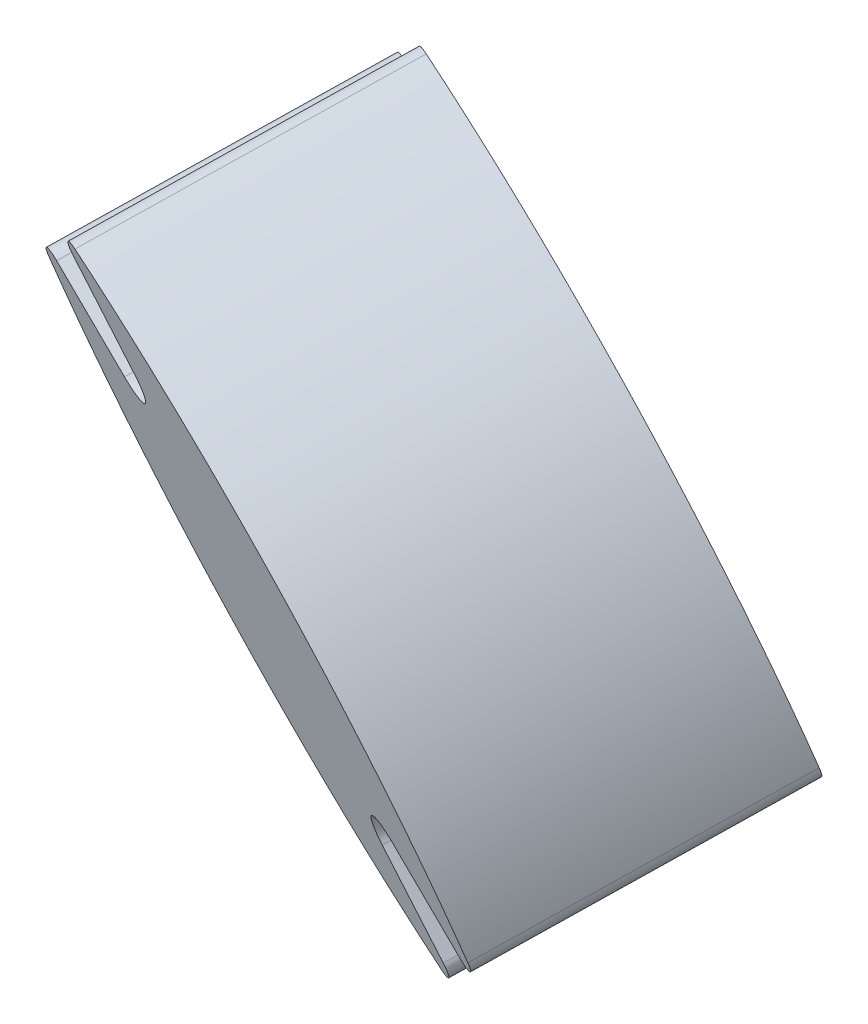
ISO-10303-21;
HEADER;
FILE_DESCRIPTION(('STEP AP214'),'2;1');
FILE_NAME('part.step','',(''),(''),'','','');
FILE_SCHEMA(('AUTOMOTIVE_DESIGN { 1 0 10303 214 1 1 1 1 }'));
ENDSEC;
DATA;
#1=APPLICATION_CONTEXT('core data for automotive mechanical design processes');
#2=APPLICATION_PROTOCOL_DEFINITION('international standard','automotive_design',2000,#1);
#3=PRODUCT_CONTEXT('',#1,'mechanical');
#4=PRODUCT('Part','Part','',(#3));
#5=PRODUCT_RELATED_PRODUCT_CATEGORY('part','',(#4));
#6=PRODUCT_DEFINITION_FORMATION('','',#4);
#7=PRODUCT_DEFINITION_CONTEXT('part definition',#1,'design');
#8=PRODUCT_DEFINITION('design','',#6,#7);
#9=PRODUCT_DEFINITION_SHAPE('','',#8);
#10=(LENGTH_UNIT() NAMED_UNIT(*) SI_UNIT(.MILLI.,.METRE.));
#11=(NAMED_UNIT(*) PLANE_ANGLE_UNIT() SI_UNIT($,.RADIAN.));
#12=(NAMED_UNIT(*) SI_UNIT($,.STERADIAN.) SOLID_ANGLE_UNIT());
#13=UNCERTAINTY_MEASURE_WITH_UNIT(LENGTH_MEASURE(1.E-05),#10,'distance_accuracy_value','');
#14=(GEOMETRIC_REPRESENTATION_CONTEXT(3) GLOBAL_UNCERTAINTY_ASSIGNED_CONTEXT((#13)) GLOBAL_UNIT_ASSIGNED_CONTEXT((#10,
#11,#12)) REPRESENTATION_CONTEXT('',''));
#15=CARTESIAN_POINT('',(0.,0.,0.));
#16=DIRECTION('',(0.,0.,1.));
#17=DIRECTION('',(1.,0.,0.));
#18=AXIS2_PLACEMENT_3D('',#15,#16,#17);
#19=CARTESIAN_POINT('',(24.2522786898409,17.837579396562,-3.28254901722241));
#20=DIRECTION('',(0.7696030963663,0.44294277050906,0.459905181659395));
#21=DIRECTION('',(0.512972214604096,0.,-0.858405211449796));
#22=AXIS2_PLACEMENT_3D('',#19,#20,#21);
#23=PLANE('',#22);
#24=DIRECTION('',(0.538333378028067,-0.837440387104316,-0.0942908911160778));
#25=VECTOR('',#24,1.);
#26=CARTESIAN_POINT('',(24.2522786898409,17.837579396562,-3.28254901722241));
#27=LINE('',#26,#25);
#28=CARTESIAN_POINT('',(24.2522786898409,17.8375793965621,-3.28254901722241));
#29=VERTEX_POINT('',#28);
#30=CARTESIAN_POINT('',(24.7126216075303,17.1214622711432,-3.36317961844372));
#31=VERTEX_POINT('',#30);
#32=EDGE_CURVE('E136',#29,#31,#27,.T.);
#33=ORIENTED_EDGE('',*,*,#32,.T.);
#34=DIRECTION('',(0.343377704815397,0.320148871777388,-0.882947592858928));
#35=VECTOR('',#34,1.);
#36=CARTESIAN_POINT('',(24.7126216075302,17.1214622711432,-3.36317961844372));
#37=LINE('',#36,#35);
#38=CARTESIAN_POINT('',(25.5848009777614,17.9346404054578,-5.6058665043054));
#39=VERTEX_POINT('',#38);
#40=EDGE_CURVE('E126',#39,#31,#37,.F.);
#41=ORIENTED_EDGE('',*,*,#40,.F.);
#42=DIRECTION('',(-0.538333378028076,0.837440387104308,0.0942908911160961));
#43=VECTOR('',#42,1.);
#44=CARTESIAN_POINT('',(25.5848009777614,17.9346404054578,-5.6058665043054));
#45=LINE('',#44,#43);
#46=CARTESIAN_POINT('',(25.124458060072,18.6507575308766,-5.5252359030841));
#47=VERTEX_POINT('',#46);
#48=EDGE_CURVE('E198',#39,#47,#45,.T.);
#49=ORIENTED_EDGE('',*,*,#48,.T.);
#50=DIRECTION('',(0.343377704815397,0.320148871777388,-0.882947592858928));
#51=VECTOR('',#50,1.);
#52=CARTESIAN_POINT('',(24.2522786898409,17.837579396562,-3.28254901722242));
#53=LINE('',#52,#51);
#54=EDGE_CURVE('E129',#47,#29,#53,.F.);
#55=ORIENTED_EDGE('',*,*,#54,.T.);
#56=EDGE_LOOP('',(#33,#41,#49,#55));
#57=FACE_BOUND('',#56,.T.);
#58=ADVANCED_FACE('F17',(#57),#23,.T.);
#59=CARTESIAN_POINT('',(21.9689361588296,20.293136827309,-3.28017625642764));
#60=DIRECTION('',(0.498079777136854,0.734944997551023,0.460187338137447));
#61=DIRECTION('',(-0.827806849443742,0.561013208413158,0.));
#62=AXIS2_PLACEMENT_3D('',#59,#60,#61);
#63=PLANE('',#62);
#64=DIRECTION('',(0.796246373582333,-0.597796412229437,0.0929040477191262));
#65=VECTOR('',#64,1.);
#66=CARTESIAN_POINT('',(21.2880451092031,20.8043281370472,-3.35962093167485));
#67=LINE('',#66,#65);
#68=CARTESIAN_POINT('',(21.2880451092032,20.8043281370472,-3.35962093167486));
#69=VERTEX_POINT('',#68);
#70=CARTESIAN_POINT('',(21.9689361588295,20.2931368273091,-3.28017625642764));
#71=VERTEX_POINT('',#70);
#72=EDGE_CURVE('E125',#69,#71,#67,.T.);
#73=ORIENTED_EDGE('',*,*,#72,.T.);
#74=DIRECTION('',(0.343377704815388,0.320148871777399,-0.882947592858928));
#75=VECTOR('',#74,1.);
#76=CARTESIAN_POINT('',(21.9689361588296,20.293136827309,-3.28017625642764));
#77=LINE('',#76,#75);
#78=CARTESIAN_POINT('',(22.8411155290606,21.1063149616236,-5.52286314228933));
#79=VERTEX_POINT('',#78);
#80=EDGE_CURVE('E109',#71,#79,#77,.T.);
#81=ORIENTED_EDGE('',*,*,#80,.T.);
#82=DIRECTION('',(-0.79624637358233,0.59779641222944,-0.0929040477191298));
#83=VECTOR('',#82,1.);
#84=CARTESIAN_POINT('',(22.8411155290606,21.1063149616236,-5.52286314228933));
#85=LINE('',#84,#83);
#86=CARTESIAN_POINT('',(22.1602244794343,21.6175062713618,-5.60230781753654));
#87=VERTEX_POINT('',#86);
#88=EDGE_CURVE('E118',#79,#87,#85,.T.);
#89=ORIENTED_EDGE('',*,*,#88,.T.);
#90=DIRECTION('',(0.343377704815397,0.320148871777388,-0.882947592858928));
#91=VECTOR('',#90,1.);
#92=CARTESIAN_POINT('',(21.2880451092032,20.8043281370472,-3.35962093167484));
#93=LINE('',#92,#91);
#94=EDGE_CURVE('E166',#69,#87,#93,.T.);
#95=ORIENTED_EDGE('',*,*,#94,.F.);
#96=EDGE_LOOP('',(#73,#81,#89,#95));
#97=FACE_BOUND('',#96,.T.);
#98=ADVANCED_FACE('F128',(#97),#63,.T.);
#99=CARTESIAN_POINT('',(24.447757876318,17.9500868602714,-3.16573310108092));
#100=DIRECTION('',(0.343377704815397,0.320148871777388,-0.882947592858928));
#101=DIRECTION('',(-0.932001392324764,0.,-0.36245469331311));
#102=AXIS2_PLACEMENT_3D('',#99,#100,#101);
#103=CYLINDRICAL_SURFACE('',#102,0.254);
#104=DIRECTION('',(0.343377704815401,0.320148871777389,-0.882947592858926));
#105=VECTOR('',#104,1.);
#106=CARTESIAN_POINT('',(24.5742701397107,18.1367628896494,-3.04884551719401));
#107=LINE('',#106,#105);
#108=CARTESIAN_POINT('',(24.5742701397107,18.1367628896494,-3.04884551719401));
#109=VERTEX_POINT('',#108);
#110=CARTESIAN_POINT('',(25.4464495099418,18.9499410239639,-5.29153240305569));
#111=VERTEX_POINT('',#110);
#112=EDGE_CURVE('E185',#109,#111,#107,.T.);
#113=ORIENTED_EDGE('',*,*,#112,.F.);
#114=CARTESIAN_POINT('',(24.447757876318,17.9500868602714,-3.16573310108092));
#115=DIRECTION('',(0.343377704815397,0.320148871777388,-0.882947592858928));
#116=DIRECTION('',(-0.932001392324764,0.,-0.36245469331311));
#117=AXIS2_PLACEMENT_3D('',#114,#115,#116);
#118=CIRCLE('',#117,0.254);
#119=EDGE_CURVE('E20',#29,#109,#118,.T.);
#120=ORIENTED_EDGE('',*,*,#119,.F.);
#121=ORIENTED_EDGE('',*,*,#54,.F.);
#122=CARTESIAN_POINT('',(25.3199372465491,18.763264994586,-5.40841998694261));
#123=DIRECTION('',(0.343377704815397,0.320148871777388,-0.882947592858928));
#124=DIRECTION('',(-0.932001392324764,0.,-0.36245469331311));
#125=AXIS2_PLACEMENT_3D('',#122,#123,#124);
#126=CIRCLE('',#125,0.254);
#127=EDGE_CURVE('E115',#111,#47,#126,.F.);
#128=ORIENTED_EDGE('',*,*,#127,.F.);
#129=EDGE_LOOP('',(#113,#120,#121,#128));
#130=FACE_BOUND('',#129,.T.);
#131=ADVANCED_FACE('F186',(#130),#103,.F.);
#132=CARTESIAN_POINT('',(22.0954484222223,20.4798128566871,-3.16328867254073));
#133=DIRECTION('',(0.343377704815397,0.320148871777388,-0.882947592858928));
#134=DIRECTION('',(-0.932001392324764,0.,-0.36245469331311));
#135=AXIS2_PLACEMENT_3D('',#132,#133,#134);
#136=CYLINDRICAL_SURFACE('',#135,0.254);
#137=CARTESIAN_POINT('',(22.0954484222223,20.479812856687,-3.1632886725407));
#138=DIRECTION('',(0.343377704815397,0.320148871777388,-0.882947592858928));
#139=DIRECTION('',(-0.932001392324764,0.,-0.36245469331311));
#140=AXIS2_PLACEMENT_3D('',#137,#138,#139);
#141=CIRCLE('',#140,0.254);
#142=CARTESIAN_POINT('',(22.2909276086993,20.5923203203963,-3.04647275639924));
#143=VERTEX_POINT('',#142);
#144=EDGE_CURVE('E100',#143,#71,#141,.T.);
#145=ORIENTED_EDGE('',*,*,#144,.F.);
#146=DIRECTION('',(-0.343377704815397,-0.320148871777391,0.882947592858927));
#147=VECTOR('',#146,1.);
#148=CARTESIAN_POINT('',(23.1631069789304,21.4054984547109,-5.28915964226094));
#149=LINE('',#148,#147);
#150=CARTESIAN_POINT('',(23.1631069789304,21.4054984547109,-5.28915964226094));
#151=VERTEX_POINT('',#150);
#152=EDGE_CURVE('E112',#151,#143,#149,.T.);
#153=ORIENTED_EDGE('',*,*,#152,.F.);
#154=CARTESIAN_POINT('',(22.9676277924534,21.2929909910016,-5.40597555840241));
#155=DIRECTION('',(0.343377704815397,0.320148871777388,-0.882947592858928));
#156=DIRECTION('',(-0.932001392324764,0.,-0.36245469331311));
#157=AXIS2_PLACEMENT_3D('',#154,#155,#156);
#158=CIRCLE('',#157,0.254);
#159=EDGE_CURVE('E105',#79,#151,#158,.F.);
#160=ORIENTED_EDGE('',*,*,#159,.F.);
#161=ORIENTED_EDGE('',*,*,#80,.F.);
#162=EDGE_LOOP('',(#145,#153,#160,#161));
#163=FACE_BOUND('',#162,.T.);
#164=ADVANCED_FACE('F107',(#163),#136,.F.);
#165=CARTESIAN_POINT('',(24.6148820142917,17.0652085392885,-3.42158757651447));
#166=DIRECTION('',(0.343377704815397,0.320148871777388,-0.882947592858928));
#167=DIRECTION('',(-0.932001392324764,0.,-0.36245469331311));
#168=AXIS2_PLACEMENT_3D('',#165,#166,#167);
#169=CYLINDRICAL_SURFACE('',#168,0.127);
#170=DIRECTION('',(0.343377704815394,0.320148871777391,-0.882947592858928));
#171=VECTOR('',#170,1.);
#172=CARTESIAN_POINT('',(24.5899172271825,16.9515703869446,-3.47250053887614));
#173=LINE('',#172,#171);
#174=CARTESIAN_POINT('',(25.4620965974136,17.7647485212592,-5.71518742473783));
#175=VERTEX_POINT('',#174);
#176=CARTESIAN_POINT('',(24.5899172271825,16.9515703869446,-3.47250053887614));
#177=VERTEX_POINT('',#176);
#178=EDGE_CURVE('E205',#175,#177,#173,.F.);
#179=ORIENTED_EDGE('',*,*,#178,.F.);
#180=CARTESIAN_POINT('',(25.4870613845229,17.8783866736031,-5.66427446237615));
#181=DIRECTION('',(0.343377704815397,0.320148871777388,-0.882947592858928));
#182=DIRECTION('',(-0.932001392324764,0.,-0.36245469331311));
#183=AXIS2_PLACEMENT_3D('',#180,#181,#182);
#184=CIRCLE('',#183,0.127);
#185=EDGE_CURVE('E168',#175,#39,#184,.F.);
#186=ORIENTED_EDGE('',*,*,#185,.T.);
#187=ORIENTED_EDGE('',*,*,#40,.T.);
#188=CARTESIAN_POINT('',(24.6148820142917,17.0652085392885,-3.42158757651447));
#189=DIRECTION('',(0.343377704815397,0.320148871777388,-0.882947592858928));
#190=DIRECTION('',(-0.932001392324764,0.,-0.36245469331311));
#191=AXIS2_PLACEMENT_3D('',#188,#189,#190);
#192=CIRCLE('',#191,0.127);
#193=EDGE_CURVE('E170',#31,#177,#192,.T.);
#194=ORIENTED_EDGE('',*,*,#193,.T.);
#195=EDGE_LOOP('',(#179,#186,#187,#194));
#196=FACE_BOUND('',#195,.T.);
#197=ADVANCED_FACE('F203',(#196),#169,.T.);
#198=CARTESIAN_POINT('',(21.2247889775068,20.7109901223582,-3.41806472361829));
#199=DIRECTION('',(0.343377704815397,0.320148871777388,-0.882947592858928));
#200=DIRECTION('',(-0.932001392324764,0.,-0.36245469331311));
#201=AXIS2_PLACEMENT_3D('',#198,#199,#200);
#202=CYLINDRICAL_SURFACE('',#201,0.127);
#203=CARTESIAN_POINT('',(21.2247889775068,20.7109901223582,-3.41806472361832));
#204=DIRECTION('',(0.343377704815397,0.320148871777388,-0.882947592858928));
#205=DIRECTION('',(-0.932001392324764,0.,-0.36245469331311));
#206=AXIS2_PLACEMENT_3D('',#203,#204,#205);
#207=CIRCLE('',#206,0.127);
#208=CARTESIAN_POINT('',(21.1095894773587,20.6943923908466,-3.468883917574));
#209=VERTEX_POINT('',#208);
#210=EDGE_CURVE('E163',#209,#69,#207,.T.);
#211=ORIENTED_EDGE('',*,*,#210,.T.);
#212=ORIENTED_EDGE('',*,*,#94,.T.);
#213=CARTESIAN_POINT('',(22.0969683477379,21.5241682566728,-5.66075160947999));
#214=DIRECTION('',(0.343377704815397,0.320148871777388,-0.882947592858928));
#215=DIRECTION('',(-0.932001392324764,0.,-0.36245469331311));
#216=AXIS2_PLACEMENT_3D('',#213,#214,#215);
#217=CIRCLE('',#216,0.127);
#218=CARTESIAN_POINT('',(21.9817688475898,21.5075705251612,-5.71157080343569));
#219=VERTEX_POINT('',#218);
#220=EDGE_CURVE('E121',#87,#219,#217,.F.);
#221=ORIENTED_EDGE('',*,*,#220,.T.);
#222=DIRECTION('',(0.343377704815394,0.320148871777391,-0.882947592858928));
#223=VECTOR('',#222,1.);
#224=CARTESIAN_POINT('',(21.1095894773587,20.6943923908466,-3.46888391757399));
#225=LINE('',#224,#223);
#226=EDGE_CURVE('E212',#209,#219,#225,.T.);
#227=ORIENTED_EDGE('',*,*,#226,.F.);
#228=EDGE_LOOP('',(#211,#212,#221,#227));
#229=FACE_BOUND('',#228,.T.);
#230=ADVANCED_FACE('F255',(#229),#202,.T.);
#231=CARTESIAN_POINT('',(24.5742701397107,18.1367628896494,-3.04884551719401));
#232=DIRECTION('',(-0.498079777136854,-0.734944997551023,-0.460187338137447));
#233=DIRECTION('',(0.827806849443742,-0.561013208413158,0.));
#234=AXIS2_PLACEMENT_3D('',#231,#232,#233);
#235=PLANE('',#234);
#236=DIRECTION('',(-0.796246373582327,0.597796412229442,-0.0929040477191369));
#237=VECTOR('',#236,1.);
#238=CARTESIAN_POINT('',(25.2551611893371,17.6255715799112,-2.9694008419468));
#239=LINE('',#238,#237);
#240=CARTESIAN_POINT('',(25.2551611893371,17.6255715799112,-2.9694008419468));
#241=VERTEX_POINT('',#240);
#242=EDGE_CURVE('E180',#241,#109,#239,.T.);
#243=ORIENTED_EDGE('',*,*,#242,.T.);
#244=ORIENTED_EDGE('',*,*,#112,.T.);
#245=DIRECTION('',(0.796246373582331,-0.597796412229438,0.092904047719128));
#246=VECTOR('',#245,1.);
#247=CARTESIAN_POINT('',(25.4464495099419,18.9499410239639,-5.29153240305569));
#248=LINE('',#247,#246);
#249=CARTESIAN_POINT('',(26.1273405595682,18.4387497142258,-5.21208772780849));
#250=VERTEX_POINT('',#249);
#251=EDGE_CURVE('E192',#111,#250,#248,.T.);
#252=ORIENTED_EDGE('',*,*,#251,.T.);
#253=DIRECTION('',(0.343377704815397,0.320148871777388,-0.882947592858928));
#254=VECTOR('',#253,1.);
#255=CARTESIAN_POINT('',(25.2551611893371,17.6255715799112,-2.96940084194681));
#256=LINE('',#255,#254);
#257=EDGE_CURVE('E162',#241,#250,#256,.T.);
#258=ORIENTED_EDGE('',*,*,#257,.F.);
#259=EDGE_LOOP('',(#243,#244,#252,#258));
#260=FACE_BOUND('',#259,.T.);
#261=ADVANCED_FACE('F190',(#260),#235,.T.);
#262=CARTESIAN_POINT('',(22.2909276086993,20.5923203203963,-3.04647275639924));
#263=DIRECTION('',(-0.7696030963663,-0.442942770509061,-0.459905181659395));
#264=DIRECTION('',(-0.512972214604096,0.,0.858405211449796));
#265=AXIS2_PLACEMENT_3D('',#262,#263,#264);
#266=PLANE('',#265);
#267=DIRECTION('',(-0.53833337802806,0.837440387104323,0.0942908911160558));
#268=VECTOR('',#267,1.);
#269=CARTESIAN_POINT('',(22.2909276086993,20.5923203203963,-3.04647275639924));
#270=LINE('',#269,#268);
#271=CARTESIAN_POINT('',(21.83058469101,21.3084374458152,-2.96584215517794));
#272=VERTEX_POINT('',#271);
#273=EDGE_CURVE('E216',#143,#272,#270,.T.);
#274=ORIENTED_EDGE('',*,*,#273,.T.);
#275=DIRECTION('',(0.343377704815397,0.320148871777388,-0.882947592858928));
#276=VECTOR('',#275,1.);
#277=CARTESIAN_POINT('',(21.83058469101,21.3084374458152,-2.96584215517793));
#278=LINE('',#277,#276);
#279=CARTESIAN_POINT('',(22.7027640612411,22.1216155801297,-5.2085290410396));
#280=VERTEX_POINT('',#279);
#281=EDGE_CURVE('E155',#280,#272,#278,.F.);
#282=ORIENTED_EDGE('',*,*,#281,.F.);
#283=DIRECTION('',(-0.538333378028088,0.837440387104303,0.094290891116075));
#284=VECTOR('',#283,1.);
#285=CARTESIAN_POINT('',(23.1631069789305,21.4054984547109,-5.28915964226093));
#286=LINE('',#285,#284);
#287=EDGE_CURVE('E159',#151,#280,#286,.T.);
#288=ORIENTED_EDGE('',*,*,#287,.F.);
#289=ORIENTED_EDGE('',*,*,#152,.T.);
#290=EDGE_LOOP('',(#274,#282,#288,#289));
#291=FACE_BOUND('',#290,.T.);
#292=ADVANCED_FACE('F222',(#291),#266,.T.);
#293=CARTESIAN_POINT('',(25.5528021128168,21.3345622724637,-1.50880176081518));
#294=DIRECTION('',(0.343377704815394,0.320148871777391,-0.882947592858928));
#295=DIRECTION('',(-0.932001392324765,0.,-0.362454693313108));
#296=AXIS2_PLACEMENT_3D('',#293,#294,#295);
#297=CYLINDRICAL_SURFACE('',#296,4.89835462808358);
#298=CARTESIAN_POINT('',(25.5528021128168,21.3345622724638,-1.50880176081519));
#299=DIRECTION('',(0.343377704815394,0.320148871777391,-0.882947592858928));
#300=DIRECTION('',(-0.932001392324765,0.,-0.362454693313108));
#301=AXIS2_PLACEMENT_3D('',#298,#299,#300);
#302=CIRCLE('',#301,4.89835462808358);
#303=EDGE_CURVE('E152',#177,#209,#302,.T.);
#304=ORIENTED_EDGE('',*,*,#303,.T.);
#305=ORIENTED_EDGE('',*,*,#226,.T.);
#306=CARTESIAN_POINT('',(26.4249814830479,22.1477404067783,-3.75148864667688));
#307=DIRECTION('',(0.343377704815394,0.320148871777391,-0.882947592858928));
#308=DIRECTION('',(-0.932001392324765,0.,-0.362454693313108));
#309=AXIS2_PLACEMENT_3D('',#306,#307,#308);
#310=CIRCLE('',#309,4.89835462808358);
#311=EDGE_CURVE('E160',#175,#219,#310,.T.);
#312=ORIENTED_EDGE('',*,*,#311,.F.);
#313=ORIENTED_EDGE('',*,*,#178,.T.);
#314=EDGE_LOOP('',(#304,#305,#312,#313));
#315=FACE_BOUND('',#314,.T.);
#316=ADVANCED_FACE('F209',(#315),#297,.T.);
#317=CARTESIAN_POINT('',(25.319937246549,18.7632649945859,-5.40841998694262));
#318=DIRECTION('',(0.343377704815394,0.320148871777391,-0.882947592858928));
#319=DIRECTION('',(-0.932001392324765,0.,-0.362454693313108));
#320=AXIS2_PLACEMENT_3D('',#317,#318,#319);
#321=PLANE('',#320);
#322=CARTESIAN_POINT('',(26.1905966912646,18.5320877289148,-5.15364393586505));
#323=DIRECTION('',(0.343377704815397,0.320148871777388,-0.882947592858928));
#324=DIRECTION('',(-0.932001392324764,0.,-0.36245469331311));
#325=AXIS2_PLACEMENT_3D('',#322,#323,#324);
#326=CIRCLE('',#325,0.127);
#327=CARTESIAN_POINT('',(26.3057961914126,18.5486854604263,-5.10282474190934));
#328=VERTEX_POINT('',#327);
#329=EDGE_CURVE('E146',#250,#328,#326,.F.);
#330=ORIENTED_EDGE('',*,*,#329,.F.);
#331=ORIENTED_EDGE('',*,*,#251,.F.);
#332=ORIENTED_EDGE('',*,*,#127,.T.);
#333=ORIENTED_EDGE('',*,*,#48,.F.);
#334=ORIENTED_EDGE('',*,*,#185,.F.);
#335=ORIENTED_EDGE('',*,*,#311,.T.);
#336=ORIENTED_EDGE('',*,*,#220,.F.);
#337=ORIENTED_EDGE('',*,*,#88,.F.);
#338=ORIENTED_EDGE('',*,*,#159,.T.);
#339=ORIENTED_EDGE('',*,*,#287,.T.);
#340=CARTESIAN_POINT('',(22.8005036544797,22.1778693119844,-5.15012108296886));
#341=DIRECTION('',(0.343377704815397,0.320148871777388,-0.882947592858928));
#342=DIRECTION('',(-0.932001392324764,0.,-0.36245469331311));
#343=AXIS2_PLACEMENT_3D('',#340,#341,#342);
#344=CIRCLE('',#343,0.127);
#345=CARTESIAN_POINT('',(22.8254684415888,22.2915074643284,-5.09920812060719));
#346=VERTEX_POINT('',#345);
#347=EDGE_CURVE('E156',#346,#280,#344,.F.);
#348=ORIENTED_EDGE('',*,*,#347,.F.);
#349=CARTESIAN_POINT('',(21.8625835559546,17.9085155788092,-7.06290689866814));
#350=DIRECTION('',(0.343377704815394,0.320148871777391,-0.882947592858928));
#351=DIRECTION('',(-0.932001392324765,0.,-0.362454693313108));
#352=AXIS2_PLACEMENT_3D('',#349,#350,#351);
#353=CIRCLE('',#352,4.89835462808358);
#354=EDGE_CURVE('E143',#328,#346,#353,.F.);
#355=ORIENTED_EDGE('',*,*,#354,.F.);
#356=EDGE_LOOP('',(#330,#331,#332,#333,#334,#335,#336,#337,#338,#339,#348,#355));
#357=FACE_BOUND('',#356,.T.);
#358=ADVANCED_FACE('F119',(#357),#321,.T.);
#359=CARTESIAN_POINT('',(21.9283242842485,21.3646911776698,-2.90743419710719));
#360=DIRECTION('',(0.343377704815397,0.320148871777388,-0.882947592858928));
#361=DIRECTION('',(-0.932001392324764,0.,-0.36245469331311));
#362=AXIS2_PLACEMENT_3D('',#359,#360,#361);
#363=CYLINDRICAL_SURFACE('',#362,0.127);
#364=CARTESIAN_POINT('',(21.9283242842485,21.3646911776698,-2.90743419710719));
#365=DIRECTION('',(0.343377704815397,0.320148871777388,-0.882947592858928));
#366=DIRECTION('',(-0.932001392324764,0.,-0.36245469331311));
#367=AXIS2_PLACEMENT_3D('',#364,#365,#366);
#368=CIRCLE('',#367,0.127);
#369=CARTESIAN_POINT('',(21.9532890713577,21.4783293300138,-2.85652123474551));
#370=VERTEX_POINT('',#369);
#371=EDGE_CURVE('E150',#272,#370,#368,.T.);
#372=ORIENTED_EDGE('',*,*,#371,.T.);
#373=DIRECTION('',(0.343377704815394,0.320148871777391,-0.882947592858928));
#374=VECTOR('',#373,1.);
#375=CARTESIAN_POINT('',(21.9532890713577,21.4783293300138,-2.85652123474552));
#376=LINE('',#375,#374);
#377=EDGE_CURVE('E142',#346,#370,#376,.F.);
#378=ORIENTED_EDGE('',*,*,#377,.F.);
#379=ORIENTED_EDGE('',*,*,#347,.T.);
#380=ORIENTED_EDGE('',*,*,#281,.T.);
#381=EDGE_LOOP('',(#372,#378,#379,#380));
#382=FACE_BOUND('',#381,.T.);
#383=ADVANCED_FACE('F227',(#382),#363,.T.);
#384=CARTESIAN_POINT('',(24.447757876318,17.9500868602714,-3.16573310108092));
#385=DIRECTION('',(0.343377704815394,0.320148871777391,-0.882947592858928));
#386=DIRECTION('',(-0.932001392324765,0.,-0.362454693313108));
#387=AXIS2_PLACEMENT_3D('',#384,#385,#386);
#388=PLANE('',#387);
#389=ORIENTED_EDGE('',*,*,#242,.F.);
#390=CARTESIAN_POINT('',(25.3184173210334,17.7189095946002,-2.91095705000334));
#391=DIRECTION('',(0.343377704815397,0.320148871777388,-0.882947592858928));
#392=DIRECTION('',(-0.932001392324764,0.,-0.36245469331311));
#393=AXIS2_PLACEMENT_3D('',#390,#391,#392);
#394=CIRCLE('',#393,0.127);
#395=CARTESIAN_POINT('',(25.4336168211815,17.7355073261118,-2.86013785604764));
#396=VERTEX_POINT('',#395);
#397=EDGE_CURVE('E35',#396,#241,#394,.T.);
#398=ORIENTED_EDGE('',*,*,#397,.F.);
#399=CARTESIAN_POINT('',(20.9904041857235,17.0953374444946,-4.82022001280645));
#400=DIRECTION('',(0.343377704815394,0.320148871777391,-0.882947592858928));
#401=DIRECTION('',(-0.932001392324765,0.,-0.362454693313108));
#402=AXIS2_PLACEMENT_3D('',#399,#400,#401);
#403=CIRCLE('',#402,4.89835462808358);
#404=EDGE_CURVE('E26',#370,#396,#403,.T.);
#405=ORIENTED_EDGE('',*,*,#404,.F.);
#406=ORIENTED_EDGE('',*,*,#371,.F.);
#407=ORIENTED_EDGE('',*,*,#273,.F.);
#408=ORIENTED_EDGE('',*,*,#144,.T.);
#409=ORIENTED_EDGE('',*,*,#72,.F.);
#410=ORIENTED_EDGE('',*,*,#210,.F.);
#411=ORIENTED_EDGE('',*,*,#303,.F.);
#412=ORIENTED_EDGE('',*,*,#193,.F.);
#413=ORIENTED_EDGE('',*,*,#32,.F.);
#414=ORIENTED_EDGE('',*,*,#119,.T.);
#415=EDGE_LOOP('',(#389,#398,#405,#406,#407,#408,#409,#410,#411,#412,#413,#414));
#416=FACE_BOUND('',#415,.T.);
#417=ADVANCED_FACE('F178',(#416),#388,.F.);
#418=CARTESIAN_POINT('',(25.3184173210335,17.7189095946002,-2.91095705000335));
#419=DIRECTION('',(0.343377704815397,0.320148871777388,-0.882947592858928));
#420=DIRECTION('',(-0.932001392324764,0.,-0.36245469331311));
#421=AXIS2_PLACEMENT_3D('',#418,#419,#420);
#422=CYLINDRICAL_SURFACE('',#421,0.127);
#423=ORIENTED_EDGE('',*,*,#329,.T.);
#424=DIRECTION('',(0.343377704815394,0.320148871777391,-0.882947592858928));
#425=VECTOR('',#424,1.);
#426=CARTESIAN_POINT('',(25.4336168211815,17.7355073261118,-2.86013785604767));
#427=LINE('',#426,#425);
#428=EDGE_CURVE('E11',#396,#328,#427,.T.);
#429=ORIENTED_EDGE('',*,*,#428,.F.);
#430=ORIENTED_EDGE('',*,*,#397,.T.);
#431=ORIENTED_EDGE('',*,*,#257,.T.);
#432=EDGE_LOOP('',(#423,#429,#430,#431));
#433=FACE_BOUND('',#432,.T.);
#434=ADVANCED_FACE('F234',(#433),#422,.T.);
#435=CARTESIAN_POINT('',(20.9904041857235,17.0953374444947,-4.82022001280647));
#436=DIRECTION('',(0.343377704815394,0.320148871777391,-0.882947592858928));
#437=DIRECTION('',(-0.932001392324765,0.,-0.362454693313108));
#438=AXIS2_PLACEMENT_3D('',#435,#436,#437);
#439=CYLINDRICAL_SURFACE('',#438,4.89835462808358);
#440=ORIENTED_EDGE('',*,*,#404,.T.);
#441=ORIENTED_EDGE('',*,*,#428,.T.);
#442=ORIENTED_EDGE('',*,*,#354,.T.);
#443=ORIENTED_EDGE('',*,*,#377,.T.);
#444=EDGE_LOOP('',(#440,#441,#442,#443));
#445=FACE_BOUND('',#444,.T.);
#446=ADVANCED_FACE('F231',(#445),#439,.T.);
#447=CLOSED_SHELL('',(#58,#98,#131,#164,#197,#230,#261,#292,#316,#358,#383,#417,#434,#446));
#448=MANIFOLD_SOLID_BREP('B1',#447);
#449=ADVANCED_BREP_SHAPE_REPRESENTATION('',(#18,#448),#14);
#450=SHAPE_DEFINITION_REPRESENTATION(#9,#449);
ENDSEC;
END-ISO-10303-21;
